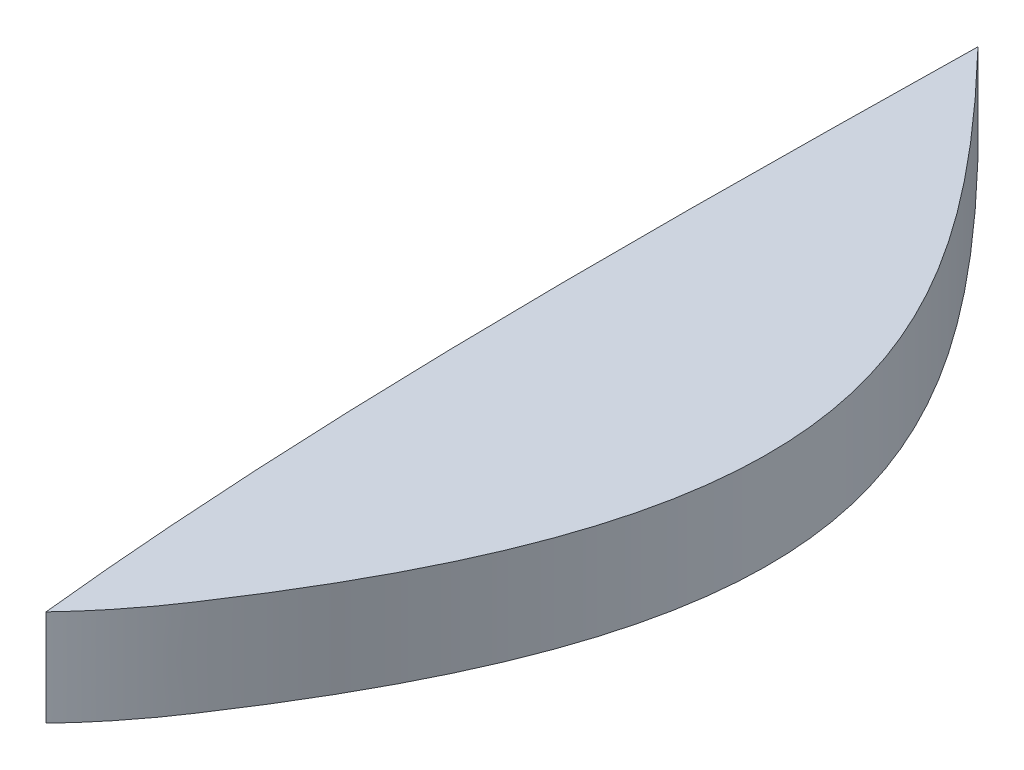
ISO-10303-21;
HEADER;
FILE_DESCRIPTION(('STEP AP214'),'2;1');
FILE_NAME('part.step','',(''),(''),'','','');
FILE_SCHEMA(('AUTOMOTIVE_DESIGN { 1 0 10303 214 1 1 1 1 }'));
ENDSEC;
DATA;
#1=APPLICATION_CONTEXT('core data for automotive mechanical design processes');
#2=APPLICATION_PROTOCOL_DEFINITION('international standard','automotive_design',2000,#1);
#3=PRODUCT_CONTEXT('',#1,'mechanical');
#4=PRODUCT('Part','Part','',(#3));
#5=PRODUCT_RELATED_PRODUCT_CATEGORY('part','',(#4));
#6=PRODUCT_DEFINITION_FORMATION('','',#4);
#7=PRODUCT_DEFINITION_CONTEXT('part definition',#1,'design');
#8=PRODUCT_DEFINITION('design','',#6,#7);
#9=PRODUCT_DEFINITION_SHAPE('','',#8);
#10=(LENGTH_UNIT() NAMED_UNIT(*) SI_UNIT(.MILLI.,.METRE.));
#11=(NAMED_UNIT(*) PLANE_ANGLE_UNIT() SI_UNIT($,.RADIAN.));
#12=(NAMED_UNIT(*) SI_UNIT($,.STERADIAN.) SOLID_ANGLE_UNIT());
#13=UNCERTAINTY_MEASURE_WITH_UNIT(LENGTH_MEASURE(1.E-05),#10,'distance_accuracy_value','');
#14=(GEOMETRIC_REPRESENTATION_CONTEXT(3) GLOBAL_UNCERTAINTY_ASSIGNED_CONTEXT((#13)) GLOBAL_UNIT_ASSIGNED_CONTEXT((#10,
#11,#12)) REPRESENTATION_CONTEXT('',''));
#15=CARTESIAN_POINT('',(0.,0.,0.));
#16=DIRECTION('',(0.,0.,1.));
#17=DIRECTION('',(1.,0.,0.));
#18=AXIS2_PLACEMENT_3D('',#15,#16,#17);
#19=CARTESIAN_POINT('',(654.568618804249,-19.7359999999999,-1844.16269284411));
#20=CARTESIAN_POINT('',(-376.656747031333,-19.7359999999999,196.677526014199));
#21=CARTESIAN_POINT('',(146.383112040834,-19.7359999999999,-18.1054168033917));
#22=CARTESIAN_POINT('',(15.8197135998304,-19.7359999999999,176.000772848282));
#23=CARTESIAN_POINT('',(-529.227195614881,-19.7359999999999,-290.790137158722));
#24=CARTESIAN_POINT('',(222.613056059059,-19.7359999999999,2040.83590084113));
#25=B_SPLINE_CURVE_WITH_KNOTS('',3,(#19,#20,#21,#22,#23,#24),.UNSPECIFIED.,.F.,.F.,(4,2,4),
(-4.84139575157978,0.935895264978839,5.93270419189678),.UNSPECIFIED.);
#26=DIRECTION('',(0.,1.,0.));
#27=VECTOR('',#26,1.);
#28=SURFACE_OF_LINEAR_EXTRUSION('',#25,#27);
#29=CARTESIAN_POINT('',(654.568618804249,-15.7359999999999,-1844.16269284411));
#30=CARTESIAN_POINT('',(-376.656747031333,-15.7359999999999,196.677526014199));
#31=CARTESIAN_POINT('',(146.383112040834,-15.7359999999999,-18.1054168033917));
#32=CARTESIAN_POINT('',(15.8197135998304,-15.7359999999999,176.000772848282));
#33=CARTESIAN_POINT('',(-529.227195614881,-15.7359999999999,-290.790137158722));
#34=CARTESIAN_POINT('',(222.613056059059,-15.7359999999999,2040.83590084113));
#35=B_SPLINE_CURVE_WITH_KNOTS('',3,(#29,#30,#31,#32,#33,#34),.UNSPECIFIED.,.F.,.F.,(4,2,4),
(-4.84139575157978,0.935895264978839,5.93270419189678),.UNSPECIFIED.);
#36=CARTESIAN_POINT('',(72.8357776681303,-15.7359999999999,49.5539933656316));
#37=VERTEX_POINT('',#36);
#38=CARTESIAN_POINT('',(73.806553330199,-15.7359999999999,89.1749760513482));
#39=VERTEX_POINT('',#38);
#40=EDGE_CURVE('E77',#37,#39,#35,.T.);
#41=ORIENTED_EDGE('',*,*,#40,.T.);
#42=DIRECTION('',(0.,1.,0.));
#43=VECTOR('',#42,1.);
#44=CARTESIAN_POINT('',(73.806553330199,-19.7359999999999,89.1749760513482));
#45=LINE('',#44,#43);
#46=CARTESIAN_POINT('',(73.806553330199,-19.7359999999999,89.1749760513482));
#47=VERTEX_POINT('',#46);
#48=EDGE_CURVE('E11',#47,#39,#45,.T.);
#49=ORIENTED_EDGE('',*,*,#48,.F.);
#50=CARTESIAN_POINT('',(72.8357776681303,-19.7359999999999,49.5539933656316));
#51=VERTEX_POINT('',#50);
#52=EDGE_CURVE('E71',#51,#47,#25,.T.);
#53=ORIENTED_EDGE('',*,*,#52,.F.);
#54=DIRECTION('',(0.,1.,0.));
#55=VECTOR('',#54,1.);
#56=CARTESIAN_POINT('',(72.8357776681303,-19.7359999999999,49.5539933656316));
#57=LINE('',#56,#55);
#58=EDGE_CURVE('E78',#51,#37,#57,.T.);
#59=ORIENTED_EDGE('',*,*,#58,.T.);
#60=EDGE_LOOP('',(#41,#49,#53,#59));
#61=FACE_BOUND('',#60,.T.);
#62=ADVANCED_FACE('F30',(#61),#28,.F.);
#63=CARTESIAN_POINT('',(73.806553330199,-19.7359999999999,89.1749760513482));
#64=DIRECTION('',(0.241561932412522,0.,-0.970385404264269));
#65=DIRECTION('',(-0.970385404264269,0.,-0.241561932412522));
#66=AXIS2_PLACEMENT_3D('',#63,#64,#65);
#67=PLANE('',#66);
#68=DIRECTION('',(-0.970385404264269,0.,-0.241561932412522));
#69=VECTOR('',#68,1.);
#70=CARTESIAN_POINT('',(73.806553330199,-15.7359999999999,89.1749760513482));
#71=LINE('',#70,#69);
#72=CARTESIAN_POINT('',(73.8063796499491,-15.7359999999999,89.1749328164267));
#73=VERTEX_POINT('',#72);
#74=EDGE_CURVE('E59',#39,#73,#71,.T.);
#75=ORIENTED_EDGE('',*,*,#74,.T.);
#76=DIRECTION('',(0.,1.,0.));
#77=VECTOR('',#76,1.);
#78=CARTESIAN_POINT('',(73.8063796499491,-19.7359999999999,89.1749328164267));
#79=LINE('',#78,#77);
#80=CARTESIAN_POINT('',(73.8063796499491,-19.7359999999999,89.1749328164267));
#81=VERTEX_POINT('',#80);
#82=EDGE_CURVE('E39',#81,#73,#79,.T.);
#83=ORIENTED_EDGE('',*,*,#82,.F.);
#84=DIRECTION('',(-0.970385404264269,0.,-0.241561932412522));
#85=VECTOR('',#84,1.);
#86=CARTESIAN_POINT('',(73.806553330199,-19.7359999999999,89.1749760513482));
#87=LINE('',#86,#85);
#88=EDGE_CURVE('E67',#47,#81,#87,.T.);
#89=ORIENTED_EDGE('',*,*,#88,.F.);
#90=ORIENTED_EDGE('',*,*,#48,.T.);
#91=EDGE_LOOP('',(#75,#83,#89,#90));
#92=FACE_BOUND('',#91,.T.);
#93=ADVANCED_FACE('F68',(#92),#67,.F.);
#94=CARTESIAN_POINT('',(73.8064010568217,-19.7359999999999,89.1751358616624));
#95=CARTESIAN_POINT('',(73.7728215317816,-19.7359999999999,88.8566324209081));
#96=CARTESIAN_POINT('',(73.7050787909353,-19.7359999999999,88.2140892038748));
#97=CARTESIAN_POINT('',(73.6111699203922,-19.7359999999999,87.2411108144054));
#98=CARTESIAN_POINT('',(73.5215494096635,-19.7359999999999,86.2510121565547));
#99=CARTESIAN_POINT('',(73.4144460915684,-19.7359999999999,84.9783802682826));
#100=CARTESIAN_POINT('',(73.2953730977758,-19.7359999999999,83.4173400385958));
#101=CARTESIAN_POINT('',(73.131342483069,-19.7359999999999,80.9662200992494));
#102=CARTESIAN_POINT('',(72.9670751536242,-19.7359999999999,77.8950176906123));
#103=CARTESIAN_POINT('',(72.8278309111338,-19.7359999999999,74.2142192242548));
#104=CARTESIAN_POINT('',(72.7386538051691,-19.7359999999999,70.5319639809361));
#105=CARTESIAN_POINT('',(72.6922179207041,-19.7359999999999,66.8484676971494));
#106=CARTESIAN_POINT('',(72.6815027139617,-19.7359999999999,63.1639398227206));
#107=CARTESIAN_POINT('',(72.6997539207934,-19.7359999999999,59.4788022744994));
#108=CARTESIAN_POINT('',(72.7400193048159,-19.7359999999999,55.7934766845731));
#109=CARTESIAN_POINT('',(72.7889527068731,-19.7359999999999,52.4852296820177));
#110=CARTESIAN_POINT('',(72.8221765507695,-19.7359999999999,50.4054214945807));
#111=CARTESIAN_POINT('',(72.8357776681303,-19.7359999999999,49.5539933656316));
#112=B_SPLINE_CURVE_WITH_KNOTS('',3,(#94,#95,#96,#97,#98,#99,#100,#101,#102,#103,#104,#105,#106,
#107,#108,#109,#110,#111),.UNSPECIFIED.,.F.,.F.,(4,1,1,1,1,1,1,1,1,1,1,1,1,1,1,4),(0.,
0.0242269894492689,0.0488751006987535,0.0739432164957052,0.0994299548101802,0.145484554689178,
0.192370912472773,0.285260206491317,0.378129135262776,0.470998839251954,0.563882819118807,
0.656788352951241,0.749716766192477,0.84265045807289,0.935584527994814,1.),.UNSPECIFIED.);
#113=DIRECTION('',(0.,1.,0.));
#114=VECTOR('',#113,1.);
#115=SURFACE_OF_LINEAR_EXTRUSION('',#112,#114);
#116=CARTESIAN_POINT('',(73.8064010568217,-15.7359999999999,89.1751358616624));
#117=CARTESIAN_POINT('',(73.7728215317816,-15.7359999999999,88.8566324209081));
#118=CARTESIAN_POINT('',(73.7050787909353,-15.7359999999999,88.2140892038748));
#119=CARTESIAN_POINT('',(73.6111699203922,-15.7359999999999,87.2411108144054));
#120=CARTESIAN_POINT('',(73.5215494096635,-15.7359999999999,86.2510121565547));
#121=CARTESIAN_POINT('',(73.4144460915684,-15.7359999999999,84.9783802682826));
#122=CARTESIAN_POINT('',(73.2953730977758,-15.7359999999999,83.4173400385958));
#123=CARTESIAN_POINT('',(73.131342483069,-15.7359999999999,80.9662200992494));
#124=CARTESIAN_POINT('',(72.9670751536242,-15.7359999999999,77.8950176906123));
#125=CARTESIAN_POINT('',(72.8278309111338,-15.7359999999999,74.2142192242548));
#126=CARTESIAN_POINT('',(72.7386538051691,-15.7359999999999,70.5319639809361));
#127=CARTESIAN_POINT('',(72.6922179207041,-15.7359999999999,66.8484676971494));
#128=CARTESIAN_POINT('',(72.6815027139617,-15.7359999999999,63.1639398227206));
#129=CARTESIAN_POINT('',(72.6997539207934,-15.7359999999999,59.4788022744994));
#130=CARTESIAN_POINT('',(72.7400193048159,-15.7359999999999,55.7934766845731));
#131=CARTESIAN_POINT('',(72.7889527068731,-15.7359999999999,52.4852296820177));
#132=CARTESIAN_POINT('',(72.8221765507695,-15.7359999999999,50.4054214945807));
#133=CARTESIAN_POINT('',(72.8357776681303,-15.7359999999999,49.5539933656316));
#134=B_SPLINE_CURVE_WITH_KNOTS('',3,(#116,#117,#118,#119,#120,#121,#122,#123,#124,#125,#126,
#127,#128,#129,#130,#131,#132,#133),.UNSPECIFIED.,.F.,.F.,(4,1,1,1,1,1,1,1,1,1,1,1,1,1,1,4),(0.,
0.0242269894492689,0.0488751006987535,0.0739432164957052,0.0994299548101802,0.145484554689178,
0.192370912472773,0.285260206491317,0.378129135262776,0.470998839251954,0.563882819118807,
0.656788352951241,0.749716766192477,0.84265045807289,0.935584527994814,1.),.UNSPECIFIED.);
#135=EDGE_CURVE('E64',#73,#37,#134,.T.);
#136=ORIENTED_EDGE('',*,*,#135,.T.);
#137=ORIENTED_EDGE('',*,*,#58,.F.);
#138=EDGE_CURVE('E47',#81,#51,#112,.T.);
#139=ORIENTED_EDGE('',*,*,#138,.F.);
#140=ORIENTED_EDGE('',*,*,#82,.T.);
#141=EDGE_LOOP('',(#136,#137,#139,#140));
#142=FACE_BOUND('',#141,.T.);
#143=ADVANCED_FACE('F98',(#142),#115,.F.);
#144=CARTESIAN_POINT('',(83.1036427979848,-19.7359999999999,68.4576993485217));
#145=DIRECTION('',(0.,-1.,0.));
#146=DIRECTION('',(0.,0.,-1.));
#147=AXIS2_PLACEMENT_3D('',#144,#145,#146);
#148=PLANE('',#147);
#149=ORIENTED_EDGE('',*,*,#52,.T.);
#150=ORIENTED_EDGE('',*,*,#88,.T.);
#151=ORIENTED_EDGE('',*,*,#138,.T.);
#152=EDGE_LOOP('',(#149,#150,#151));
#153=FACE_BOUND('',#152,.T.);
#154=ADVANCED_FACE('F74',(#153),#148,.T.);
#155=CARTESIAN_POINT('',(83.1036427979848,-15.7359999999999,68.4576993485217));
#156=DIRECTION('',(0.,-1.,0.));
#157=DIRECTION('',(0.,0.,-1.));
#158=AXIS2_PLACEMENT_3D('',#155,#156,#157);
#159=PLANE('',#158);
#160=ORIENTED_EDGE('',*,*,#40,.F.);
#161=ORIENTED_EDGE('',*,*,#135,.F.);
#162=ORIENTED_EDGE('',*,*,#74,.F.);
#163=EDGE_LOOP('',(#160,#161,#162));
#164=FACE_BOUND('',#163,.T.);
#165=ADVANCED_FACE('F99',(#164),#159,.F.);
#166=CLOSED_SHELL('',(#62,#93,#143,#154,#165));
#167=MANIFOLD_SOLID_BREP('B2',#166);
#168=ADVANCED_BREP_SHAPE_REPRESENTATION('',(#18,#167),#14);
#169=SHAPE_DEFINITION_REPRESENTATION(#9,#168);
ENDSEC;
END-ISO-10303-21;
